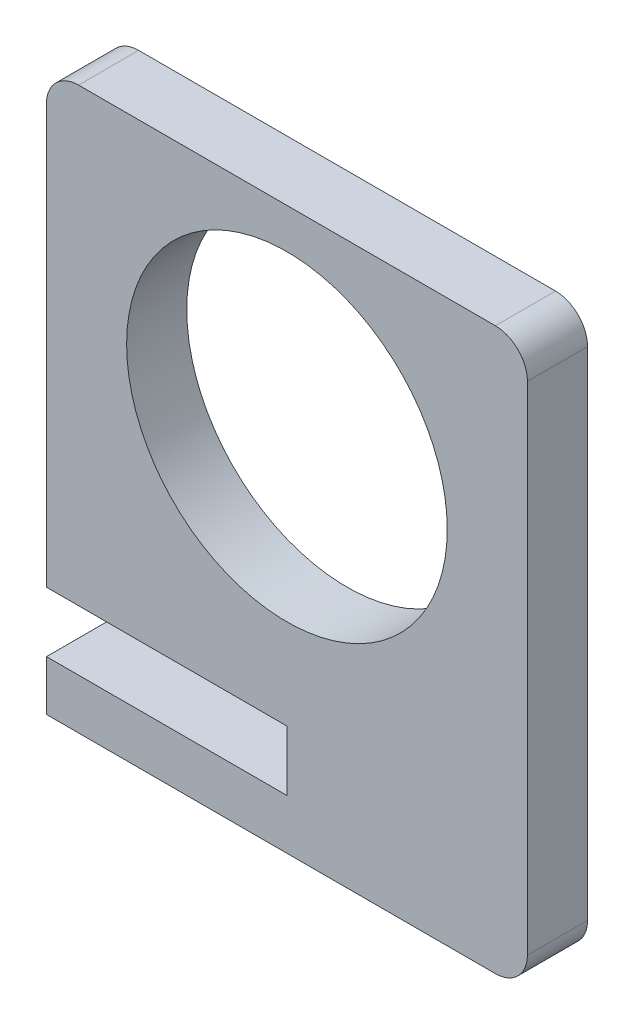
ISO-10303-21;
HEADER;
FILE_DESCRIPTION(('STEP AP214'),'2;1');
FILE_NAME('part.step','',(''),(''),'','','');
FILE_SCHEMA(('AUTOMOTIVE_DESIGN { 1 0 10303 214 1 1 1 1 }'));
ENDSEC;
DATA;
#1=APPLICATION_CONTEXT('core data for automotive mechanical design processes');
#2=APPLICATION_PROTOCOL_DEFINITION('international standard','automotive_design',2000,#1);
#3=PRODUCT_CONTEXT('',#1,'mechanical');
#4=PRODUCT('Part','Part','',(#3));
#5=PRODUCT_RELATED_PRODUCT_CATEGORY('part','',(#4));
#6=PRODUCT_DEFINITION_FORMATION('','',#4);
#7=PRODUCT_DEFINITION_CONTEXT('part definition',#1,'design');
#8=PRODUCT_DEFINITION('design','',#6,#7);
#9=PRODUCT_DEFINITION_SHAPE('','',#8);
#10=(LENGTH_UNIT() NAMED_UNIT(*) SI_UNIT(.MILLI.,.METRE.));
#11=(NAMED_UNIT(*) PLANE_ANGLE_UNIT() SI_UNIT($,.RADIAN.));
#12=(NAMED_UNIT(*) SI_UNIT($,.STERADIAN.) SOLID_ANGLE_UNIT());
#13=UNCERTAINTY_MEASURE_WITH_UNIT(LENGTH_MEASURE(1.E-05),#10,'distance_accuracy_value','');
#14=(GEOMETRIC_REPRESENTATION_CONTEXT(3) GLOBAL_UNCERTAINTY_ASSIGNED_CONTEXT((#13)) GLOBAL_UNIT_ASSIGNED_CONTEXT((#10,
#11,#12)) REPRESENTATION_CONTEXT('',''));
#15=CARTESIAN_POINT('',(0.,0.,0.));
#16=DIRECTION('',(0.,0.,1.));
#17=DIRECTION('',(1.,0.,0.));
#18=AXIS2_PLACEMENT_3D('',#15,#16,#17);
#19=CARTESIAN_POINT('',(-19.05,0.,2.38125));
#20=DIRECTION('',(-1.,0.,0.));
#21=DIRECTION('',(0.,0.,1.));
#22=AXIS2_PLACEMENT_3D('',#19,#20,#21);
#23=PLANE('',#22);
#24=DIRECTION('',(0.,1.,0.));
#25=VECTOR('',#24,1.);
#26=CARTESIAN_POINT('',(-19.05,0.,2.38125));
#27=LINE('',#26,#25);
#28=CARTESIAN_POINT('',(-19.05,2.38125,2.38125));
#29=VERTEX_POINT('',#28);
#30=CARTESIAN_POINT('',(-19.05,35.56,2.38125));
#31=VERTEX_POINT('',#30);
#32=EDGE_CURVE('E122',#29,#31,#27,.T.);
#33=ORIENTED_EDGE('',*,*,#32,.T.);
#34=DIRECTION('',(0.,0.,-1.));
#35=VECTOR('',#34,1.);
#36=CARTESIAN_POINT('',(-19.05,35.56,2.38125));
#37=LINE('',#36,#35);
#38=CARTESIAN_POINT('',(-19.05,35.56,-2.38125));
#39=VERTEX_POINT('',#38);
#40=EDGE_CURVE('E209',#31,#39,#37,.T.);
#41=ORIENTED_EDGE('',*,*,#40,.T.);
#42=DIRECTION('',(0.,1.,0.));
#43=VECTOR('',#42,1.);
#44=CARTESIAN_POINT('',(-19.05,0.,-2.38125));
#45=LINE('',#44,#43);
#46=CARTESIAN_POINT('',(-19.05,2.38125,-2.38125));
#47=VERTEX_POINT('',#46);
#48=EDGE_CURVE('E125',#47,#39,#45,.T.);
#49=ORIENTED_EDGE('',*,*,#48,.F.);
#50=DIRECTION('',(0.,0.,-1.));
#51=VECTOR('',#50,1.);
#52=CARTESIAN_POINT('',(-19.05,2.38125,2.38125));
#53=LINE('',#52,#51);
#54=EDGE_CURVE('E118',#29,#47,#53,.T.);
#55=ORIENTED_EDGE('',*,*,#54,.F.);
#56=EDGE_LOOP('',(#33,#41,#49,#55));
#57=FACE_BOUND('',#56,.T.);
#58=ADVANCED_FACE('F35',(#57),#23,.T.);
#59=CARTESIAN_POINT('',(0.,2.38125,2.38125));
#60=DIRECTION('',(0.,1.,0.));
#61=DIRECTION('',(0.,0.,1.));
#62=AXIS2_PLACEMENT_3D('',#59,#60,#61);
#63=PLANE('',#62);
#64=DIRECTION('',(1.,0.,0.));
#65=VECTOR('',#64,1.);
#66=CARTESIAN_POINT('',(0.,2.38125,-2.38125));
#67=LINE('',#66,#65);
#68=CARTESIAN_POINT('',(0.,2.38125,-2.38125));
#69=VERTEX_POINT('',#68);
#70=EDGE_CURVE('E167',#47,#69,#67,.T.);
#71=ORIENTED_EDGE('',*,*,#70,.T.);
#72=DIRECTION('',(0.,0.,-1.));
#73=VECTOR('',#72,1.);
#74=CARTESIAN_POINT('',(0.,2.38125,2.38125));
#75=LINE('',#74,#73);
#76=CARTESIAN_POINT('',(0.,2.38125,2.38125));
#77=VERTEX_POINT('',#76);
#78=EDGE_CURVE('E130',#77,#69,#75,.T.);
#79=ORIENTED_EDGE('',*,*,#78,.F.);
#80=DIRECTION('',(1.,0.,0.));
#81=VECTOR('',#80,1.);
#82=CARTESIAN_POINT('',(0.,2.38125,2.38125));
#83=LINE('',#82,#81);
#84=EDGE_CURVE('E133',#29,#77,#83,.T.);
#85=ORIENTED_EDGE('',*,*,#84,.F.);
#86=ORIENTED_EDGE('',*,*,#54,.T.);
#87=EDGE_LOOP('',(#71,#79,#85,#86));
#88=FACE_BOUND('',#87,.T.);
#89=ADVANCED_FACE('F134',(#88),#63,.F.);
#90=CARTESIAN_POINT('',(0.,0.,2.38125));
#91=DIRECTION('',(-1.,0.,0.));
#92=DIRECTION('',(0.,0.,1.));
#93=AXIS2_PLACEMENT_3D('',#90,#91,#92);
#94=PLANE('',#93);
#95=DIRECTION('',(0.,1.,0.));
#96=VECTOR('',#95,1.);
#97=CARTESIAN_POINT('',(0.,0.,-2.38125));
#98=LINE('',#97,#96);
#99=CARTESIAN_POINT('',(0.,-2.38125,-2.38125));
#100=VERTEX_POINT('',#99);
#101=EDGE_CURVE('E169',#100,#69,#98,.T.);
#102=ORIENTED_EDGE('',*,*,#101,.F.);
#103=DIRECTION('',(0.,0.,-1.));
#104=VECTOR('',#103,1.);
#105=CARTESIAN_POINT('',(0.,-2.38125,2.38125));
#106=LINE('',#105,#104);
#107=CARTESIAN_POINT('',(0.,-2.38125,2.38125));
#108=VERTEX_POINT('',#107);
#109=EDGE_CURVE('E190',#108,#100,#106,.T.);
#110=ORIENTED_EDGE('',*,*,#109,.F.);
#111=DIRECTION('',(0.,1.,0.));
#112=VECTOR('',#111,1.);
#113=CARTESIAN_POINT('',(0.,0.,2.38125));
#114=LINE('',#113,#112);
#115=EDGE_CURVE('E137',#108,#77,#114,.T.);
#116=ORIENTED_EDGE('',*,*,#115,.T.);
#117=ORIENTED_EDGE('',*,*,#78,.T.);
#118=EDGE_LOOP('',(#102,#110,#116,#117));
#119=FACE_BOUND('',#118,.T.);
#120=ADVANCED_FACE('F232',(#119),#94,.T.);
#121=CARTESIAN_POINT('',(0.,-2.38125,2.38125));
#122=DIRECTION('',(0.,1.,0.));
#123=DIRECTION('',(0.,0.,1.));
#124=AXIS2_PLACEMENT_3D('',#121,#122,#123);
#125=PLANE('',#124);
#126=DIRECTION('',(1.,0.,0.));
#127=VECTOR('',#126,1.);
#128=CARTESIAN_POINT('',(0.,-2.38125,-2.38125));
#129=LINE('',#128,#127);
#130=CARTESIAN_POINT('',(-19.05,-2.38125,-2.38125));
#131=VERTEX_POINT('',#130);
#132=EDGE_CURVE('E172',#131,#100,#129,.T.);
#133=ORIENTED_EDGE('',*,*,#132,.F.);
#134=DIRECTION('',(0.,0.,-1.));
#135=VECTOR('',#134,1.);
#136=CARTESIAN_POINT('',(-19.05,-2.38125,2.38125));
#137=LINE('',#136,#135);
#138=CARTESIAN_POINT('',(-19.05,-2.38125,2.38125));
#139=VERTEX_POINT('',#138);
#140=EDGE_CURVE('E188',#139,#131,#137,.T.);
#141=ORIENTED_EDGE('',*,*,#140,.F.);
#142=DIRECTION('',(1.,0.,0.));
#143=VECTOR('',#142,1.);
#144=CARTESIAN_POINT('',(0.,-2.38125,2.38125));
#145=LINE('',#144,#143);
#146=EDGE_CURVE('E150',#139,#108,#145,.T.);
#147=ORIENTED_EDGE('',*,*,#146,.T.);
#148=ORIENTED_EDGE('',*,*,#109,.T.);
#149=EDGE_LOOP('',(#133,#141,#147,#148));
#150=FACE_BOUND('',#149,.T.);
#151=ADVANCED_FACE('F266',(#150),#125,.T.);
#152=CARTESIAN_POINT('',(-19.05,0.,2.38125));
#153=DIRECTION('',(1.,0.,0.));
#154=DIRECTION('',(0.,0.,-1.));
#155=AXIS2_PLACEMENT_3D('',#152,#153,#154);
#156=PLANE('',#155);
#157=DIRECTION('',(0.,-1.,0.));
#158=VECTOR('',#157,1.);
#159=CARTESIAN_POINT('',(-19.05,0.,-2.38125));
#160=LINE('',#159,#158);
#161=CARTESIAN_POINT('',(-19.05,-6.35,-2.38125));
#162=VERTEX_POINT('',#161);
#163=EDGE_CURVE('E175',#131,#162,#160,.T.);
#164=ORIENTED_EDGE('',*,*,#163,.T.);
#165=DIRECTION('',(0.,0.,-1.));
#166=VECTOR('',#165,1.);
#167=CARTESIAN_POINT('',(-19.05,-6.35,2.38125));
#168=LINE('',#167,#166);
#169=CARTESIAN_POINT('',(-19.05,-6.35,2.38125));
#170=VERTEX_POINT('',#169);
#171=EDGE_CURVE('E162',#170,#162,#168,.T.);
#172=ORIENTED_EDGE('',*,*,#171,.F.);
#173=DIRECTION('',(0.,-1.,0.));
#174=VECTOR('',#173,1.);
#175=CARTESIAN_POINT('',(-19.05,0.,2.38125));
#176=LINE('',#175,#174);
#177=EDGE_CURVE('E153',#139,#170,#176,.T.);
#178=ORIENTED_EDGE('',*,*,#177,.F.);
#179=ORIENTED_EDGE('',*,*,#140,.T.);
#180=EDGE_LOOP('',(#164,#172,#178,#179));
#181=FACE_BOUND('',#180,.T.);
#182=ADVANCED_FACE('F262',(#181),#156,.F.);
#183=CARTESIAN_POINT('',(0.,-6.35,2.38125));
#184=DIRECTION('',(0.,1.,0.));
#185=DIRECTION('',(0.,0.,1.));
#186=AXIS2_PLACEMENT_3D('',#183,#184,#185);
#187=PLANE('',#186);
#188=DIRECTION('',(1.,0.,0.));
#189=VECTOR('',#188,1.);
#190=CARTESIAN_POINT('',(0.,-6.35,-2.38125));
#191=LINE('',#190,#189);
#192=CARTESIAN_POINT('',(16.51,-6.35,-2.38125));
#193=VERTEX_POINT('',#192);
#194=EDGE_CURVE('E178',#162,#193,#191,.T.);
#195=ORIENTED_EDGE('',*,*,#194,.T.);
#196=DIRECTION('',(0.,0.,-1.));
#197=VECTOR('',#196,1.);
#198=CARTESIAN_POINT('',(16.51,-6.35,2.38125));
#199=LINE('',#198,#197);
#200=CARTESIAN_POINT('',(16.51,-6.35,2.38125));
#201=VERTEX_POINT('',#200);
#202=EDGE_CURVE('E203',#193,#201,#199,.F.);
#203=ORIENTED_EDGE('',*,*,#202,.T.);
#204=DIRECTION('',(1.,0.,0.));
#205=VECTOR('',#204,1.);
#206=CARTESIAN_POINT('',(0.,-6.35,2.38125));
#207=LINE('',#206,#205);
#208=EDGE_CURVE('E156',#170,#201,#207,.T.);
#209=ORIENTED_EDGE('',*,*,#208,.F.);
#210=ORIENTED_EDGE('',*,*,#171,.T.);
#211=EDGE_LOOP('',(#195,#203,#209,#210));
#212=FACE_BOUND('',#211,.T.);
#213=ADVANCED_FACE('F245',(#212),#187,.F.);
#214=CARTESIAN_POINT('',(19.05,0.,2.38125));
#215=DIRECTION('',(-1.,0.,0.));
#216=DIRECTION('',(0.,0.,1.));
#217=AXIS2_PLACEMENT_3D('',#214,#215,#216);
#218=PLANE('',#217);
#219=DIRECTION('',(0.,1.,0.));
#220=VECTOR('',#219,1.);
#221=CARTESIAN_POINT('',(19.05,0.,2.38125));
#222=LINE('',#221,#220);
#223=CARTESIAN_POINT('',(19.05,-3.81,2.38125));
#224=VERTEX_POINT('',#223);
#225=CARTESIAN_POINT('',(19.05,35.56,2.38125));
#226=VERTEX_POINT('',#225);
#227=EDGE_CURVE('E158',#224,#226,#222,.T.);
#228=ORIENTED_EDGE('',*,*,#227,.F.);
#229=DIRECTION('',(0.,0.,-1.));
#230=VECTOR('',#229,1.);
#231=CARTESIAN_POINT('',(19.05,-3.81,2.38125));
#232=LINE('',#231,#230);
#233=CARTESIAN_POINT('',(19.05,-3.81,-2.38125));
#234=VERTEX_POINT('',#233);
#235=EDGE_CURVE('E194',#224,#234,#232,.T.);
#236=ORIENTED_EDGE('',*,*,#235,.T.);
#237=DIRECTION('',(0.,1.,0.));
#238=VECTOR('',#237,1.);
#239=CARTESIAN_POINT('',(19.05,0.,-2.38125));
#240=LINE('',#239,#238);
#241=CARTESIAN_POINT('',(19.05,35.56,-2.38125));
#242=VERTEX_POINT('',#241);
#243=EDGE_CURVE('E181',#234,#242,#240,.T.);
#244=ORIENTED_EDGE('',*,*,#243,.T.);
#245=DIRECTION('',(0.,0.,-1.));
#246=VECTOR('',#245,1.);
#247=CARTESIAN_POINT('',(19.05,35.56,2.38125));
#248=LINE('',#247,#246);
#249=EDGE_CURVE('E129',#242,#226,#248,.F.);
#250=ORIENTED_EDGE('',*,*,#249,.T.);
#251=EDGE_LOOP('',(#228,#236,#244,#250));
#252=FACE_BOUND('',#251,.T.);
#253=ADVANCED_FACE('F238',(#252),#218,.F.);
#254=CARTESIAN_POINT('',(0.,22.225,2.38125));
#255=DIRECTION('',(0.,0.,-1.));
#256=DIRECTION('',(-1.,0.,0.));
#257=AXIS2_PLACEMENT_3D('',#254,#255,#256);
#258=CYLINDRICAL_SURFACE('',#257,12.7);
#259=CARTESIAN_POINT('',(0.,22.225,2.38125));
#260=DIRECTION('',(0.,0.,1.));
#261=DIRECTION('',(1.,0.,0.));
#262=AXIS2_PLACEMENT_3D('',#259,#260,#261);
#263=CIRCLE('',#262,12.7);
#264=CARTESIAN_POINT('',(-12.7,22.225,2.38125));
#265=VERTEX_POINT('',#264);
#266=EDGE_CURVE('E143',#265,#265,#263,.T.);
#267=CARTESIAN_POINT('',(0.,22.225,-2.38125));
#268=DIRECTION('',(0.,0.,1.));
#269=DIRECTION('',(1.,0.,0.));
#270=AXIS2_PLACEMENT_3D('',#267,#268,#269);
#271=CIRCLE('',#270,12.7);
#272=CARTESIAN_POINT('',(-12.7,22.225,-2.38125));
#273=VERTEX_POINT('',#272);
#274=EDGE_CURVE('E163',#273,#273,#271,.T.);
#275=CARTESIAN_POINT('',(-12.7,22.225,2.38125));
#276=CARTESIAN_POINT('',(-12.7,22.225,2.331640625));
#277=CARTESIAN_POINT('',(-12.7,22.225,2.28203125));
#278=CARTESIAN_POINT('',(-12.7,22.225,2.1828125));
#279=CARTESIAN_POINT('',(-12.7,22.225,2.133203125));
#280=CARTESIAN_POINT('',(-12.7,22.225,2.033984375));
#281=CARTESIAN_POINT('',(-12.7,22.225,1.984375));
#282=CARTESIAN_POINT('',(-12.7,22.225,1.88515625));
#283=CARTESIAN_POINT('',(-12.7,22.225,1.835546875));
#284=CARTESIAN_POINT('',(-12.7,22.225,1.736328125));
#285=CARTESIAN_POINT('',(-12.7,22.225,1.68671875));
#286=CARTESIAN_POINT('',(-12.7,22.225,1.5875));
#287=CARTESIAN_POINT('',(-12.7,22.225,1.537890625));
#288=CARTESIAN_POINT('',(-12.7,22.225,1.438671875));
#289=CARTESIAN_POINT('',(-12.7,22.225,1.3890625));
#290=CARTESIAN_POINT('',(-12.7,22.225,1.28984375));
#291=CARTESIAN_POINT('',(-12.7,22.225,1.240234375));
#292=CARTESIAN_POINT('',(-12.7,22.225,1.141015625));
#293=CARTESIAN_POINT('',(-12.7,22.225,1.09140625));
#294=CARTESIAN_POINT('',(-12.7,22.225,0.9921875));
#295=CARTESIAN_POINT('',(-12.7,22.225,0.942578125));
#296=CARTESIAN_POINT('',(-12.7,22.225,0.843359375));
#297=CARTESIAN_POINT('',(-12.7,22.225,0.79375));
#298=CARTESIAN_POINT('',(-12.7,22.225,0.69453125));
#299=CARTESIAN_POINT('',(-12.7,22.225,0.644921875));
#300=CARTESIAN_POINT('',(-12.7,22.225,0.545703125));
#301=CARTESIAN_POINT('',(-12.7,22.225,0.49609375));
#302=CARTESIAN_POINT('',(-12.7,22.225,0.396875));
#303=CARTESIAN_POINT('',(-12.7,22.225,0.347265625));
#304=CARTESIAN_POINT('',(-12.7,22.225,0.248046875));
#305=CARTESIAN_POINT('',(-12.7,22.225,0.1984375));
#306=CARTESIAN_POINT('',(-12.7,22.225,0.09921875));
#307=CARTESIAN_POINT('',(-12.7,22.225,0.049609375));
#308=CARTESIAN_POINT('',(-12.7,22.225,-0.049609375));
#309=CARTESIAN_POINT('',(-12.7,22.225,-0.09921875));
#310=CARTESIAN_POINT('',(-12.7,22.225,-0.1984375));
#311=CARTESIAN_POINT('',(-12.7,22.225,-0.248046875));
#312=CARTESIAN_POINT('',(-12.7,22.225,-0.347265625));
#313=CARTESIAN_POINT('',(-12.7,22.225,-0.396875));
#314=CARTESIAN_POINT('',(-12.7,22.225,-0.49609375));
#315=CARTESIAN_POINT('',(-12.7,22.225,-0.545703125));
#316=CARTESIAN_POINT('',(-12.7,22.225,-0.644921875));
#317=CARTESIAN_POINT('',(-12.7,22.225,-0.69453125));
#318=CARTESIAN_POINT('',(-12.7,22.225,-0.79375));
#319=CARTESIAN_POINT('',(-12.7,22.225,-0.843359375));
#320=CARTESIAN_POINT('',(-12.7,22.225,-0.942578125));
#321=CARTESIAN_POINT('',(-12.7,22.225,-0.9921875));
#322=CARTESIAN_POINT('',(-12.7,22.225,-1.09140625));
#323=CARTESIAN_POINT('',(-12.7,22.225,-1.141015625));
#324=CARTESIAN_POINT('',(-12.7,22.225,-1.240234375));
#325=CARTESIAN_POINT('',(-12.7,22.225,-1.28984375));
#326=CARTESIAN_POINT('',(-12.7,22.225,-1.3890625));
#327=CARTESIAN_POINT('',(-12.7,22.225,-1.438671875));
#328=CARTESIAN_POINT('',(-12.7,22.225,-1.537890625));
#329=CARTESIAN_POINT('',(-12.7,22.225,-1.5875));
#330=CARTESIAN_POINT('',(-12.7,22.225,-1.68671875));
#331=CARTESIAN_POINT('',(-12.7,22.225,-1.736328125));
#332=CARTESIAN_POINT('',(-12.7,22.225,-1.835546875));
#333=CARTESIAN_POINT('',(-12.7,22.225,-1.88515625));
#334=CARTESIAN_POINT('',(-12.7,22.225,-1.984375));
#335=CARTESIAN_POINT('',(-12.7,22.225,-2.033984375));
#336=CARTESIAN_POINT('',(-12.7,22.225,-2.133203125));
#337=CARTESIAN_POINT('',(-12.7,22.225,-2.1828125));
#338=CARTESIAN_POINT('',(-12.7,22.225,-2.28203125));
#339=CARTESIAN_POINT('',(-12.7,22.225,-2.331640625));
#340=CARTESIAN_POINT('',(-12.7,22.225,-2.38125));
#341=B_SPLINE_CURVE_WITH_KNOTS('',3,(#275,#276,#277,#278,#279,#280,#281,#282,#283,#284,#285,
#286,#287,#288,#289,#290,#291,#292,#293,#294,#295,#296,#297,#298,#299,#300,#301,#302,#303,#304,
#305,#306,#307,#308,#309,#310,#311,#312,#313,#314,#315,#316,#317,#318,#319,#320,#321,#322,#323,
#324,#325,#326,#327,#328,#329,#330,#331,#332,#333,#334,#335,#336,#337,#338,#339,#340),
.UNSPECIFIED.,.F.,.F.,(4,2,2,2,2,2,2,2,2,2,2,2,2,2,2,2,2,2,2,2,2,2,2,2,2,2,2,2,2,2,2,2,4),(0.,
0.148828125,0.29765625,0.446484375,0.5953125,0.744140625,0.89296875,1.041796875,1.190625,
1.339453125,1.48828125,1.637109375,1.7859375,1.934765625,2.08359375,2.232421875,2.38125,
2.530078125,2.67890625,2.827734375,2.9765625,3.125390625,3.27421875,3.423046875,3.571875,
3.720703125,3.86953125,4.018359375,4.1671875,4.316015625,4.46484375,4.613671875,4.7625),.UNSPECIFIED.);
#342=EDGE_CURVE('BSEAM236',#265,#273,#341,.T.);
#343=ORIENTED_EDGE('',*,*,#266,.T.);
#344=ORIENTED_EDGE('',*,*,#274,.F.);
#345=ORIENTED_EDGE('',*,*,#342,.T.);
#346=ORIENTED_EDGE('',*,*,#342,.F.);
#347=EDGE_LOOP('',(#343,#345,#344,#346));
#348=FACE_BOUND('',#347,.T.);
#349=ADVANCED_FACE('F236',(#348),#258,.F.);
#350=CARTESIAN_POINT('',(0.,38.1,2.38125));
#351=DIRECTION('',(0.,1.,0.));
#352=DIRECTION('',(0.,0.,1.));
#353=AXIS2_PLACEMENT_3D('',#350,#351,#352);
#354=PLANE('',#353);
#355=DIRECTION('',(1.,0.,0.));
#356=VECTOR('',#355,1.);
#357=CARTESIAN_POINT('',(0.,38.1,-2.38125));
#358=LINE('',#357,#356);
#359=CARTESIAN_POINT('',(-16.51,38.1,-2.38125));
#360=VERTEX_POINT('',#359);
#361=CARTESIAN_POINT('',(16.51,38.1,-2.38125));
#362=VERTEX_POINT('',#361);
#363=EDGE_CURVE('E146',#360,#362,#358,.T.);
#364=ORIENTED_EDGE('',*,*,#363,.F.);
#365=DIRECTION('',(0.,0.,-1.));
#366=VECTOR('',#365,1.);
#367=CARTESIAN_POINT('',(-16.51,38.1,2.38125));
#368=LINE('',#367,#366);
#369=CARTESIAN_POINT('',(-16.51,38.1,2.38125));
#370=VERTEX_POINT('',#369);
#371=EDGE_CURVE('E11',#360,#370,#368,.F.);
#372=ORIENTED_EDGE('',*,*,#371,.T.);
#373=DIRECTION('',(1.,0.,0.));
#374=VECTOR('',#373,1.);
#375=CARTESIAN_POINT('',(0.,38.1,2.38125));
#376=LINE('',#375,#374);
#377=CARTESIAN_POINT('',(16.51,38.1,2.38125));
#378=VERTEX_POINT('',#377);
#379=EDGE_CURVE('E160',#370,#378,#376,.T.);
#380=ORIENTED_EDGE('',*,*,#379,.T.);
#381=DIRECTION('',(0.,0.,-1.));
#382=VECTOR('',#381,1.);
#383=CARTESIAN_POINT('',(16.51,38.1,-2.38125));
#384=LINE('',#383,#382);
#385=EDGE_CURVE('E43',#378,#362,#384,.T.);
#386=ORIENTED_EDGE('',*,*,#385,.T.);
#387=EDGE_LOOP('',(#364,#372,#380,#386));
#388=FACE_BOUND('',#387,.T.);
#389=ADVANCED_FACE('F212',(#388),#354,.T.);
#390=CARTESIAN_POINT('',(0.,0.,2.38125));
#391=DIRECTION('',(0.,0.,1.));
#392=DIRECTION('',(1.,0.,0.));
#393=AXIS2_PLACEMENT_3D('',#390,#391,#392);
#394=PLANE('',#393);
#395=ORIENTED_EDGE('',*,*,#266,.F.);
#396=EDGE_LOOP('',(#395));
#397=FACE_BOUND('',#396,.T.);
#398=ORIENTED_EDGE('',*,*,#208,.T.);
#399=CARTESIAN_POINT('',(16.51,-3.81,2.38125));
#400=DIRECTION('',(0.,0.,1.));
#401=DIRECTION('',(1.,0.,0.));
#402=AXIS2_PLACEMENT_3D('',#399,#400,#401);
#403=CIRCLE('',#402,2.54);
#404=EDGE_CURVE('E207',#201,#224,#403,.T.);
#405=ORIENTED_EDGE('',*,*,#404,.T.);
#406=ORIENTED_EDGE('',*,*,#227,.T.);
#407=CARTESIAN_POINT('',(16.51,35.56,2.38125));
#408=DIRECTION('',(0.,0.,1.));
#409=DIRECTION('',(1.,0.,0.));
#410=AXIS2_PLACEMENT_3D('',#407,#408,#409);
#411=CIRCLE('',#410,2.54);
#412=EDGE_CURVE('E50',#226,#378,#411,.T.);
#413=ORIENTED_EDGE('',*,*,#412,.T.);
#414=ORIENTED_EDGE('',*,*,#379,.F.);
#415=CARTESIAN_POINT('',(-16.51,35.56,2.38125));
#416=DIRECTION('',(0.,0.,1.));
#417=DIRECTION('',(1.,0.,0.));
#418=AXIS2_PLACEMENT_3D('',#415,#416,#417);
#419=CIRCLE('',#418,2.54);
#420=EDGE_CURVE('E142',#370,#31,#419,.T.);
#421=ORIENTED_EDGE('',*,*,#420,.T.);
#422=ORIENTED_EDGE('',*,*,#32,.F.);
#423=ORIENTED_EDGE('',*,*,#84,.T.);
#424=ORIENTED_EDGE('',*,*,#115,.F.);
#425=ORIENTED_EDGE('',*,*,#146,.F.);
#426=ORIENTED_EDGE('',*,*,#177,.T.);
#427=EDGE_LOOP('',(#398,#405,#406,#413,#414,#421,#422,#423,#424,#425,#426));
#428=FACE_BOUND('',#427,.T.);
#429=ADVANCED_FACE('F140',(#397,#428),#394,.T.);
#430=CARTESIAN_POINT('',(0.,0.,-2.38125));
#431=DIRECTION('',(0.,0.,1.));
#432=DIRECTION('',(1.,0.,0.));
#433=AXIS2_PLACEMENT_3D('',#430,#431,#432);
#434=PLANE('',#433);
#435=ORIENTED_EDGE('',*,*,#274,.T.);
#436=EDGE_LOOP('',(#435));
#437=FACE_BOUND('',#436,.T.);
#438=ORIENTED_EDGE('',*,*,#243,.F.);
#439=CARTESIAN_POINT('',(16.51,-3.81,-2.38125));
#440=DIRECTION('',(0.,0.,1.));
#441=DIRECTION('',(1.,0.,0.));
#442=AXIS2_PLACEMENT_3D('',#439,#440,#441);
#443=CIRCLE('',#442,2.54);
#444=EDGE_CURVE('E201',#234,#193,#443,.F.);
#445=ORIENTED_EDGE('',*,*,#444,.T.);
#446=ORIENTED_EDGE('',*,*,#194,.F.);
#447=ORIENTED_EDGE('',*,*,#163,.F.);
#448=ORIENTED_EDGE('',*,*,#132,.T.);
#449=ORIENTED_EDGE('',*,*,#101,.T.);
#450=ORIENTED_EDGE('',*,*,#70,.F.);
#451=ORIENTED_EDGE('',*,*,#48,.T.);
#452=CARTESIAN_POINT('',(-16.51,35.56,-2.38125));
#453=DIRECTION('',(0.,0.,1.));
#454=DIRECTION('',(1.,0.,0.));
#455=AXIS2_PLACEMENT_3D('',#452,#453,#454);
#456=CIRCLE('',#455,2.54);
#457=EDGE_CURVE('E199',#39,#360,#456,.F.);
#458=ORIENTED_EDGE('',*,*,#457,.T.);
#459=ORIENTED_EDGE('',*,*,#363,.T.);
#460=CARTESIAN_POINT('',(16.51,35.56,-2.38125));
#461=DIRECTION('',(0.,0.,1.));
#462=DIRECTION('',(1.,0.,0.));
#463=AXIS2_PLACEMENT_3D('',#460,#461,#462);
#464=CIRCLE('',#463,2.54);
#465=EDGE_CURVE('E197',#362,#242,#464,.F.);
#466=ORIENTED_EDGE('',*,*,#465,.T.);
#467=EDGE_LOOP('',(#438,#445,#446,#447,#448,#449,#450,#451,#458,#459,#466));
#468=FACE_BOUND('',#467,.T.);
#469=ADVANCED_FACE('F216',(#437,#468),#434,.F.);
#470=CARTESIAN_POINT('',(16.51,-3.81,2.38125));
#471=DIRECTION('',(0.,0.,-1.));
#472=DIRECTION('',(-1.,0.,0.));
#473=AXIS2_PLACEMENT_3D('',#470,#471,#472);
#474=CYLINDRICAL_SURFACE('',#473,2.54);
#475=ORIENTED_EDGE('',*,*,#404,.F.);
#476=ORIENTED_EDGE('',*,*,#202,.F.);
#477=ORIENTED_EDGE('',*,*,#444,.F.);
#478=ORIENTED_EDGE('',*,*,#235,.F.);
#479=EDGE_LOOP('',(#475,#476,#477,#478));
#480=FACE_BOUND('',#479,.T.);
#481=ADVANCED_FACE('F220',(#480),#474,.T.);
#482=CARTESIAN_POINT('',(-16.51,35.56,2.38125));
#483=DIRECTION('',(0.,0.,-1.));
#484=DIRECTION('',(-1.,0.,0.));
#485=AXIS2_PLACEMENT_3D('',#482,#483,#484);
#486=CYLINDRICAL_SURFACE('',#485,2.54);
#487=ORIENTED_EDGE('',*,*,#420,.F.);
#488=ORIENTED_EDGE('',*,*,#371,.F.);
#489=ORIENTED_EDGE('',*,*,#457,.F.);
#490=ORIENTED_EDGE('',*,*,#40,.F.);
#491=EDGE_LOOP('',(#487,#488,#489,#490));
#492=FACE_BOUND('',#491,.T.);
#493=ADVANCED_FACE('F218',(#492),#486,.T.);
#494=CARTESIAN_POINT('',(16.51,35.56,2.38125));
#495=DIRECTION('',(0.,0.,1.));
#496=DIRECTION('',(1.,0.,0.));
#497=AXIS2_PLACEMENT_3D('',#494,#495,#496);
#498=CYLINDRICAL_SURFACE('',#497,2.54);
#499=ORIENTED_EDGE('',*,*,#412,.F.);
#500=ORIENTED_EDGE('',*,*,#249,.F.);
#501=ORIENTED_EDGE('',*,*,#465,.F.);
#502=ORIENTED_EDGE('',*,*,#385,.F.);
#503=EDGE_LOOP('',(#499,#500,#501,#502));
#504=FACE_BOUND('',#503,.T.);
#505=ADVANCED_FACE('F37',(#504),#498,.T.);
#506=CLOSED_SHELL('',(#58,#89,#120,#151,#182,#213,#253,#349,#389,#429,#469,#481,#493,#505));
#507=MANIFOLD_SOLID_BREP('B2',#506);
#508=ADVANCED_BREP_SHAPE_REPRESENTATION('',(#18,#507),#14);
#509=SHAPE_DEFINITION_REPRESENTATION(#9,#508);
ENDSEC;
END-ISO-10303-21;
